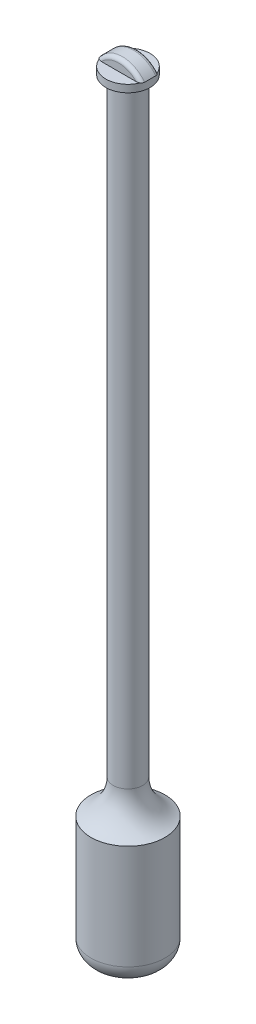
ISO-10303-21;
HEADER;
FILE_DESCRIPTION(('STEP AP214'),'2;1');
FILE_NAME('part.step','',(''),(''),'','','');
FILE_SCHEMA(('AUTOMOTIVE_DESIGN { 1 0 10303 214 1 1 1 1 }'));
ENDSEC;
DATA;
#1=APPLICATION_CONTEXT('core data for automotive mechanical design processes');
#2=APPLICATION_PROTOCOL_DEFINITION('international standard','automotive_design',2000,#1);
#3=PRODUCT_CONTEXT('',#1,'mechanical');
#4=PRODUCT('Part','Part','',(#3));
#5=PRODUCT_RELATED_PRODUCT_CATEGORY('part','',(#4));
#6=PRODUCT_DEFINITION_FORMATION('','',#4);
#7=PRODUCT_DEFINITION_CONTEXT('part definition',#1,'design');
#8=PRODUCT_DEFINITION('design','',#6,#7);
#9=PRODUCT_DEFINITION_SHAPE('','',#8);
#10=(LENGTH_UNIT() NAMED_UNIT(*) SI_UNIT(.MILLI.,.METRE.));
#11=(NAMED_UNIT(*) PLANE_ANGLE_UNIT() SI_UNIT($,.RADIAN.));
#12=(NAMED_UNIT(*) SI_UNIT($,.STERADIAN.) SOLID_ANGLE_UNIT());
#13=UNCERTAINTY_MEASURE_WITH_UNIT(LENGTH_MEASURE(1.E-05),#10,'distance_accuracy_value','');
#14=(GEOMETRIC_REPRESENTATION_CONTEXT(3) GLOBAL_UNCERTAINTY_ASSIGNED_CONTEXT((#13)) GLOBAL_UNIT_ASSIGNED_CONTEXT((#10,
#11,#12)) REPRESENTATION_CONTEXT('',''));
#15=CARTESIAN_POINT('',(0.,0.,0.));
#16=DIRECTION('',(0.,0.,1.));
#17=DIRECTION('',(1.,0.,0.));
#18=AXIS2_PLACEMENT_3D('',#15,#16,#17);
#19=CARTESIAN_POINT('',(6.,209.,0.));
#20=DIRECTION('',(0.,-1.,0.));
#21=DIRECTION('',(0.,0.,-1.));
#22=AXIS2_PLACEMENT_3D('',#19,#20,#21);
#23=PLANE('',#22);
#24=DIRECTION('',(1.,0.,0.));
#25=VECTOR('',#24,1.);
#26=CARTESIAN_POINT('',(-6.,209.,2.5));
#27=LINE('',#26,#25);
#28=CARTESIAN_POINT('',(-4.69041575982343,209.,2.5));
#29=VERTEX_POINT('',#28);
#30=CARTESIAN_POINT('',(4.69041575982343,209.,2.5));
#31=VERTEX_POINT('',#30);
#32=EDGE_CURVE('E144',#29,#31,#27,.T.);
#33=ORIENTED_EDGE('',*,*,#32,.F.);
#34=CARTESIAN_POINT('',(-4.69041575982343,209.,2.5));
#35=CARTESIAN_POINT('',(-4.77574325814398,209.,2.49997391904809));
#36=CARTESIAN_POINT('',(-4.86130209307591,209.,2.49430200358767));
#37=CARTESIAN_POINT('',(-5.02865223131832,209.,2.47079207200527));
#38=CARTESIAN_POINT('',(-5.11048485294655,209.,2.45324149410005));
#39=CARTESIAN_POINT('',(-5.25485146725927,209.,2.40985447802828));
#40=CARTESIAN_POINT('',(-5.31805131520623,209.,2.38628387835557));
#41=CARTESIAN_POINT('',(-5.44149509589768,209.,2.32965856214063));
#42=CARTESIAN_POINT('',(-5.50165862849681,209.,2.29642988457705));
#43=CARTESIAN_POINT('',(-5.55879503975131,209.,2.25827316904671));
#44=B_SPLINE_CURVE_WITH_KNOTS('',3,(#34,#35,#36,#37,#38,#39,#40,#41,#42,#43),.UNSPECIFIED.,.F.,
.F.,(4,2,2,2,4),(0.,0.256155563674324,0.506324386732511,0.707996127014092,0.913553014759009),.UNSPECIFIED.);
#45=CARTESIAN_POINT('',(-5.55879503975131,209.,2.25827316904671));
#46=VERTEX_POINT('',#45);
#47=EDGE_CURVE('E232',#29,#46,#44,.T.);
#48=ORIENTED_EDGE('',*,*,#47,.T.);
#49=CARTESIAN_POINT('',(0.,209.,0.));
#50=DIRECTION('',(0.,1.,0.));
#51=DIRECTION('',(0.,0.,1.));
#52=AXIS2_PLACEMENT_3D('',#49,#50,#51);
#53=CIRCLE('',#52,6.);
#54=CARTESIAN_POINT('',(5.55879503975147,209.,2.2582731690463));
#55=VERTEX_POINT('',#54);
#56=EDGE_CURVE('E69',#46,#55,#53,.T.);
#57=ORIENTED_EDGE('',*,*,#56,.T.);
#58=CARTESIAN_POINT('',(5.55879503975147,209.,2.2582731690463));
#59=CARTESIAN_POINT('',(5.48678233533908,209.,2.30632455032236));
#60=CARTESIAN_POINT('',(5.41009743104737,209.,2.34654228222005));
#61=CARTESIAN_POINT('',(5.25247745184863,209.,2.41172382246987));
#62=CARTESIAN_POINT('',(5.17167924843986,209.,2.4370146931475));
#63=CARTESIAN_POINT('',(5.02472243432388,209.,2.47083664106106));
#64=CARTESIAN_POINT('',(4.95908178771194,209.,2.48178108232802));
#65=CARTESIAN_POINT('',(4.82576399561053,209.,2.49642054674034));
#66=CARTESIAN_POINT('',(4.75807158470045,209.,2.49997882393611));
#67=CARTESIAN_POINT('',(4.69041575982343,209.,2.5));
#68=B_SPLINE_CURVE_WITH_KNOTS('',3,(#58,#59,#60,#61,#62,#63,#64,#65,#66,#67),.UNSPECIFIED.,.F.,
.F.,(4,2,2,2,4),(0.,0.258597069952045,0.511294664713215,0.710547332312705,0.913457168868223),.UNSPECIFIED.);
#69=EDGE_CURVE('E240',#55,#31,#68,.T.);
#70=ORIENTED_EDGE('',*,*,#69,.T.);
#71=EDGE_LOOP('',(#33,#48,#57,#70));
#72=FACE_BOUND('',#71,.T.);
#73=ADVANCED_FACE('F39',(#72),#23,.F.);
#74=CARTESIAN_POINT('',(5.55879503975131,209.,-2.25827316904671));
#75=VERTEX_POINT('',#74);
#76=CARTESIAN_POINT('',(-5.55879503975147,209.,-2.2582731690463));
#77=VERTEX_POINT('',#76);
#78=EDGE_CURVE('E61',#75,#77,#53,.T.);
#79=ORIENTED_EDGE('',*,*,#78,.T.);
#80=CARTESIAN_POINT('',(-5.55879503975147,209.,-2.2582731690463));
#81=CARTESIAN_POINT('',(-5.48678233533908,209.,-2.30632455032236));
#82=CARTESIAN_POINT('',(-5.41009743104736,209.,-2.34654228222005));
#83=CARTESIAN_POINT('',(-5.25247745184863,209.,-2.41172382246987));
#84=CARTESIAN_POINT('',(-5.17167924843985,209.,-2.4370146931475));
#85=CARTESIAN_POINT('',(-5.02472243432388,209.,-2.47083664106106));
#86=CARTESIAN_POINT('',(-4.95908178771194,209.,-2.48178108232802));
#87=CARTESIAN_POINT('',(-4.82576399561053,209.,-2.49642054674034));
#88=CARTESIAN_POINT('',(-4.75807158470045,209.,-2.49997882393611));
#89=CARTESIAN_POINT('',(-4.69041575982343,209.,-2.5));
#90=B_SPLINE_CURVE_WITH_KNOTS('',3,(#80,#81,#82,#83,#84,#85,#86,#87,#88,#89),.UNSPECIFIED.,.F.,
.F.,(4,2,2,2,4),(0.,0.258597069952045,0.511294664713215,0.710547332312702,0.91345716886822),.UNSPECIFIED.);
#91=CARTESIAN_POINT('',(-4.69041575982343,209.,-2.5));
#92=VERTEX_POINT('',#91);
#93=EDGE_CURVE('E54',#77,#92,#90,.T.);
#94=ORIENTED_EDGE('',*,*,#93,.T.);
#95=DIRECTION('',(1.,0.,0.));
#96=VECTOR('',#95,1.);
#97=CARTESIAN_POINT('',(-6.,209.,-2.5));
#98=LINE('',#97,#96);
#99=CARTESIAN_POINT('',(4.69041575982343,209.,-2.5));
#100=VERTEX_POINT('',#99);
#101=EDGE_CURVE('E147',#92,#100,#98,.T.);
#102=ORIENTED_EDGE('',*,*,#101,.T.);
#103=CARTESIAN_POINT('',(4.69041575982343,209.,-2.5));
#104=CARTESIAN_POINT('',(4.77574325814398,209.,-2.49997391904809));
#105=CARTESIAN_POINT('',(4.86130209307591,209.,-2.49430200358767));
#106=CARTESIAN_POINT('',(5.02865223131832,209.,-2.47079207200527));
#107=CARTESIAN_POINT('',(5.11048485294655,209.,-2.45324149410005));
#108=CARTESIAN_POINT('',(5.25485146725927,209.,-2.40985447802828));
#109=CARTESIAN_POINT('',(5.31805131520623,209.,-2.38628387835557));
#110=CARTESIAN_POINT('',(5.44149509589768,209.,-2.32965856214063));
#111=CARTESIAN_POINT('',(5.50165862849681,209.,-2.29642988457705));
#112=CARTESIAN_POINT('',(5.55879503975131,209.,-2.25827316904671));
#113=B_SPLINE_CURVE_WITH_KNOTS('',3,(#103,#104,#105,#106,#107,#108,#109,#110,#111,#112),
.UNSPECIFIED.,.F.,.F.,(4,2,2,2,4),(0.,0.256155563674324,0.506324386732511,0.707996127014092,
0.913553014759008),.UNSPECIFIED.);
#114=EDGE_CURVE('E11',#100,#75,#113,.T.);
#115=ORIENTED_EDGE('',*,*,#114,.T.);
#116=EDGE_LOOP('',(#79,#94,#102,#115));
#117=FACE_BOUND('',#116,.T.);
#118=ADVANCED_FACE('F245',(#117),#23,.F.);
#119=CARTESIAN_POINT('',(0.,0.,0.));
#120=DIRECTION('',(0.,1.,0.));
#121=DIRECTION('',(0.,0.,1.));
#122=AXIS2_PLACEMENT_3D('',#119,#120,#121);
#123=CYLINDRICAL_SURFACE('',#122,6.);
#124=CARTESIAN_POINT('',(6.,209.,0.));
#125=VERTEX_POINT('',#124);
#126=EDGE_CURVE('E111',#55,#125,#53,.T.);
#127=ORIENTED_EDGE('',*,*,#126,.F.);
#128=ORIENTED_EDGE('',*,*,#56,.F.);
#129=CARTESIAN_POINT('',(-6.,209.,0.));
#130=VERTEX_POINT('',#129);
#131=EDGE_CURVE('E180',#130,#46,#53,.T.);
#132=ORIENTED_EDGE('',*,*,#131,.F.);
#133=EDGE_CURVE('E122',#77,#130,#53,.T.);
#134=ORIENTED_EDGE('',*,*,#133,.F.);
#135=ORIENTED_EDGE('',*,*,#78,.F.);
#136=EDGE_CURVE('E120',#125,#75,#53,.T.);
#137=ORIENTED_EDGE('',*,*,#136,.F.);
#138=EDGE_LOOP('',(#127,#128,#132,#134,#135,#137));
#139=FACE_BOUND('',#138,.T.);
#140=CARTESIAN_POINT('',(0.,207.,0.));
#141=DIRECTION('',(0.,1.,0.));
#142=DIRECTION('',(0.,0.,1.));
#143=AXIS2_PLACEMENT_3D('',#140,#141,#142);
#144=CIRCLE('',#143,6.);
#145=CARTESIAN_POINT('',(0.,207.,6.));
#146=VERTEX_POINT('',#145);
#147=EDGE_CURVE('E175',#146,#146,#144,.T.);
#148=ORIENTED_EDGE('',*,*,#147,.T.);
#149=EDGE_LOOP('',(#148));
#150=FACE_BOUND('',#149,.T.);
#151=ADVANCED_FACE('F136',(#139,#150),#123,.T.);
#152=CARTESIAN_POINT('',(3.98903104709802,207.,0.));
#153=DIRECTION('',(0.,1.,0.));
#154=DIRECTION('',(0.,0.,1.));
#155=AXIS2_PLACEMENT_3D('',#152,#153,#154);
#156=PLANE('',#155);
#157=ORIENTED_EDGE('',*,*,#147,.F.);
#158=EDGE_LOOP('',(#157));
#159=FACE_BOUND('',#158,.T.);
#160=CARTESIAN_POINT('',(0.,207.,0.));
#161=DIRECTION('',(0.,1.,0.));
#162=DIRECTION('',(0.,0.,1.));
#163=AXIS2_PLACEMENT_3D('',#160,#161,#162);
#164=CIRCLE('',#163,3.98903104709802);
#165=CARTESIAN_POINT('',(0.,207.,3.98903104709802));
#166=VERTEX_POINT('',#165);
#167=EDGE_CURVE('E171',#166,#166,#164,.T.);
#168=ORIENTED_EDGE('',*,*,#167,.T.);
#169=EDGE_LOOP('',(#168));
#170=FACE_BOUND('',#169,.T.);
#171=ADVANCED_FACE('F299',(#159,#170),#156,.F.);
#172=CARTESIAN_POINT('',(0.,0.,0.));
#173=DIRECTION('',(0.,1.,0.));
#174=DIRECTION('',(0.,0.,1.));
#175=AXIS2_PLACEMENT_3D('',#172,#173,#174);
#176=CYLINDRICAL_SURFACE('',#175,3.98903104709802);
#177=ORIENTED_EDGE('',*,*,#167,.F.);
#178=EDGE_LOOP('',(#177));
#179=FACE_BOUND('',#178,.T.);
#180=CARTESIAN_POINT('',(0.,42.4556311256197,0.));
#181=DIRECTION('',(0.,1.,0.));
#182=DIRECTION('',(0.,0.,1.));
#183=AXIS2_PLACEMENT_3D('',#180,#181,#182);
#184=CIRCLE('',#183,3.98903104709802);
#185=CARTESIAN_POINT('',(0.,42.4556311256197,3.98903104709802));
#186=VERTEX_POINT('',#185);
#187=EDGE_CURVE('E167',#186,#186,#184,.T.);
#188=ORIENTED_EDGE('',*,*,#187,.T.);
#189=EDGE_LOOP('',(#188));
#190=FACE_BOUND('',#189,.T.);
#191=ADVANCED_FACE('F306',(#179,#190),#176,.T.);
#192=CARTESIAN_POINT('',(0.,42.4556311256197,0.));
#193=DIRECTION('',(0.,1.,0.));
#194=DIRECTION('',(0.,0.,1.));
#195=AXIS2_PLACEMENT_3D('',#192,#193,#194);
#196=TOROIDAL_SURFACE('',#195,13.989031047098,10.);
#197=ORIENTED_EDGE('',*,*,#187,.F.);
#198=EDGE_LOOP('',(#197));
#199=FACE_BOUND('',#198,.T.);
#200=CARTESIAN_POINT('',(0.,33.2857003022553,0.));
#201=DIRECTION('',(0.,1.,0.));
#202=DIRECTION('',(0.,0.,1.));
#203=AXIS2_PLACEMENT_3D('',#200,#201,#202);
#204=CIRCLE('',#203,10.);
#205=CARTESIAN_POINT('',(0.,33.2857003022553,10.));
#206=VERTEX_POINT('',#205);
#207=EDGE_CURVE('E163',#206,#206,#204,.T.);
#208=ORIENTED_EDGE('',*,*,#207,.T.);
#209=EDGE_LOOP('',(#208));
#210=FACE_BOUND('',#209,.T.);
#211=ADVANCED_FACE('F313',(#199,#210),#196,.F.);
#212=CARTESIAN_POINT('',(0.,0.,0.));
#213=DIRECTION('',(0.,1.,0.));
#214=DIRECTION('',(0.,0.,1.));
#215=AXIS2_PLACEMENT_3D('',#212,#213,#214);
#216=CYLINDRICAL_SURFACE('',#215,10.);
#217=ORIENTED_EDGE('',*,*,#207,.F.);
#218=EDGE_LOOP('',(#217));
#219=FACE_BOUND('',#218,.T.);
#220=CARTESIAN_POINT('',(0.,5.,0.));
#221=DIRECTION('',(0.,1.,0.));
#222=DIRECTION('',(0.,0.,1.));
#223=AXIS2_PLACEMENT_3D('',#220,#221,#222);
#224=CIRCLE('',#223,10.);
#225=CARTESIAN_POINT('',(0.,5.,10.));
#226=VERTEX_POINT('',#225);
#227=EDGE_CURVE('E159',#226,#226,#224,.T.);
#228=ORIENTED_EDGE('',*,*,#227,.T.);
#229=EDGE_LOOP('',(#228));
#230=FACE_BOUND('',#229,.T.);
#231=ADVANCED_FACE('F321',(#219,#230),#216,.T.);
#232=CARTESIAN_POINT('',(0.,5.,0.));
#233=DIRECTION('',(0.,1.,0.));
#234=DIRECTION('',(0.,0.,1.));
#235=AXIS2_PLACEMENT_3D('',#232,#233,#234);
#236=TOROIDAL_SURFACE('',#235,5.,5.);
#237=ORIENTED_EDGE('',*,*,#227,.F.);
#238=EDGE_LOOP('',(#237));
#239=FACE_BOUND('',#238,.T.);
#240=CARTESIAN_POINT('',(0.,0.,0.));
#241=DIRECTION('',(0.,1.,0.));
#242=DIRECTION('',(0.,0.,1.));
#243=AXIS2_PLACEMENT_3D('',#240,#241,#242);
#244=CIRCLE('',#243,4.99999999999997);
#245=CARTESIAN_POINT('',(0.,0.,4.99999999999997));
#246=VERTEX_POINT('',#245);
#247=EDGE_CURVE('E155',#246,#246,#244,.T.);
#248=ORIENTED_EDGE('',*,*,#247,.T.);
#249=EDGE_LOOP('',(#248));
#250=FACE_BOUND('',#249,.T.);
#251=ADVANCED_FACE('F329',(#239,#250),#236,.T.);
#252=CARTESIAN_POINT('',(0.,0.,0.));
#253=DIRECTION('',(0.,1.,0.));
#254=DIRECTION('',(0.,0.,1.));
#255=AXIS2_PLACEMENT_3D('',#252,#253,#254);
#256=PLANE('',#255);
#257=ORIENTED_EDGE('',*,*,#247,.F.);
#258=EDGE_LOOP('',(#257));
#259=FACE_BOUND('',#258,.T.);
#260=ADVANCED_FACE('F337',(#259),#256,.F.);
#261=CARTESIAN_POINT('',(-6.,209.,2.5));
#262=DIRECTION('',(0.,1.,0.));
#263=DIRECTION('',(0.,0.,1.));
#264=AXIS2_PLACEMENT_3D('',#261,#262,#263);
#265=PLANE('',#264);
#266=DIRECTION('',(0.,0.,-1.));
#267=VECTOR('',#266,1.);
#268=CARTESIAN_POINT('',(6.,209.,2.5));
#269=LINE('',#268,#267);
#270=CARTESIAN_POINT('',(6.,209.,1.5));
#271=VERTEX_POINT('',#270);
#272=EDGE_CURVE('E114',#271,#125,#269,.T.);
#273=ORIENTED_EDGE('',*,*,#272,.F.);
#274=CARTESIAN_POINT('',(6.,209.,1.5));
#275=CARTESIAN_POINT('',(6.00000226156927,209.,1.52398862614259));
#276=CARTESIAN_POINT('',(5.99892014774043,209.,1.54796415057114));
#277=CARTESIAN_POINT('',(5.99461993012782,209.,1.59571272715028));
#278=CARTESIAN_POINT('',(5.99140274528821,209.,1.6194858619537));
#279=CARTESIAN_POINT('',(5.97865241811576,209.,1.68995818605909));
#280=CARTESIAN_POINT('',(5.96601950220793,209.,1.73613002858179));
#281=CARTESIAN_POINT('',(5.93320270634223,209.,1.82558038761212));
#282=CARTESIAN_POINT('',(5.91302887748532,209.,1.86886266544578));
#283=CARTESIAN_POINT('',(5.86609701763331,209.,1.95175536081873));
#284=CARTESIAN_POINT('',(5.83932904945162,209.,1.99136011123585));
#285=CARTESIAN_POINT('',(5.77848573217381,209.,2.06857055010918));
#286=CARTESIAN_POINT('',(5.74405809525524,209.,2.10589634736661));
#287=CARTESIAN_POINT('',(5.67034450640265,209.,2.17528003092579));
#288=CARTESIAN_POINT('',(5.6310638212038,209.,2.2073435415788));
#289=CARTESIAN_POINT('',(5.57966853721921,209.,2.24408830608789));
#290=CARTESIAN_POINT('',(5.56928467234095,209.,2.25126406096179));
#291=CARTESIAN_POINT('',(5.55879503975162,209.,2.2582731690465));
#292=B_SPLINE_CURVE_WITH_KNOTS('',3,(#274,#275,#276,#277,#278,#279,#280,#281,#282,#283,#284,
#285,#286,#287,#288,#289,#290,#291),.UNSPECIFIED.,.F.,.F.,(4,2,2,2,2,2,2,2,4),(0.,
0.07191616525006,0.143801397516404,0.28662630579157,0.429261521092956,0.572113012943839,
0.723897732770571,0.875519152896151,0.913377192848262),.UNSPECIFIED.);
#293=EDGE_CURVE('E116',#271,#55,#292,.T.);
#294=ORIENTED_EDGE('',*,*,#293,.T.);
#295=ORIENTED_EDGE('',*,*,#126,.T.);
#296=EDGE_LOOP('',(#273,#294,#295));
#297=FACE_BOUND('',#296,.T.);
#298=ADVANCED_FACE('F113',(#297),#265,.F.);
#299=ORIENTED_EDGE('',*,*,#136,.T.);
#300=CARTESIAN_POINT('',(5.55879503975131,209.,-2.25827316904671));
#301=CARTESIAN_POINT('',(5.60656649889565,209.,-2.22639881294729));
#302=CARTESIAN_POINT('',(5.6521657772112,209.,-2.19097335715717));
#303=CARTESIAN_POINT('',(5.73758822920924,209.,-2.1130455958688));
#304=CARTESIAN_POINT('',(5.77735479665386,209.,-2.07048156418655));
#305=CARTESIAN_POINT('',(5.848974579138,209.,-1.97859619431774));
#306=CARTESIAN_POINT('',(5.88077388926566,209.,-1.92923215270933));
#307=CARTESIAN_POINT('',(5.93390190872599,209.,-1.82543009006503));
#308=CARTESIAN_POINT('',(5.95529180799997,209.,-1.77102401559188));
#309=CARTESIAN_POINT('',(5.98035948682722,209.,-1.6801248158731));
#310=CARTESIAN_POINT('',(5.98767423618845,209.,-1.64460574932503));
#311=CARTESIAN_POINT('',(5.99751657615567,209.,-1.5727388395459));
#312=CARTESIAN_POINT('',(6.00002099314964,209.,-1.53638783386403));
#313=CARTESIAN_POINT('',(6.,209.,-1.5));
#314=B_SPLINE_CURVE_WITH_KNOTS('',3,(#300,#301,#302,#303,#304,#305,#306,#307,#308,#309,#310,
#311,#312,#313),.UNSPECIFIED.,.F.,.F.,(4,2,2,2,2,2,4),(0.,0.172394268430383,0.346364306442056,
0.52148140355742,0.695556282533502,0.804045935788402,0.913056936124751),.UNSPECIFIED.);
#315=CARTESIAN_POINT('',(6.,209.,-1.5));
#316=VERTEX_POINT('',#315);
#317=EDGE_CURVE('E142',#75,#316,#314,.T.);
#318=ORIENTED_EDGE('',*,*,#317,.T.);
#319=EDGE_CURVE('E129',#125,#316,#269,.T.);
#320=ORIENTED_EDGE('',*,*,#319,.F.);
#321=EDGE_LOOP('',(#299,#318,#320));
#322=FACE_BOUND('',#321,.T.);
#323=ADVANCED_FACE('F140',(#322),#265,.F.);
#324=DIRECTION('',(0.,0.,-1.));
#325=VECTOR('',#324,1.);
#326=CARTESIAN_POINT('',(-6.,209.,2.5));
#327=LINE('',#326,#325);
#328=CARTESIAN_POINT('',(-6.,209.,-1.5));
#329=VERTEX_POINT('',#328);
#330=EDGE_CURVE('E134',#130,#329,#327,.T.);
#331=ORIENTED_EDGE('',*,*,#330,.T.);
#332=CARTESIAN_POINT('',(-6.,209.,-1.5));
#333=CARTESIAN_POINT('',(-6.00000226156927,209.,-1.52398862614259));
#334=CARTESIAN_POINT('',(-5.99892014774043,209.,-1.54796415057114));
#335=CARTESIAN_POINT('',(-5.99461993012782,209.,-1.59571272715028));
#336=CARTESIAN_POINT('',(-5.99140274528821,209.,-1.6194858619537));
#337=CARTESIAN_POINT('',(-5.97865241811576,209.,-1.68995818605909));
#338=CARTESIAN_POINT('',(-5.96601950220793,209.,-1.73613002858179));
#339=CARTESIAN_POINT('',(-5.93320270634223,209.,-1.82558038761212));
#340=CARTESIAN_POINT('',(-5.91302887748532,209.,-1.86886266544578));
#341=CARTESIAN_POINT('',(-5.86609701763331,209.,-1.95175536081873));
#342=CARTESIAN_POINT('',(-5.83932904945162,209.,-1.99136011123585));
#343=CARTESIAN_POINT('',(-5.77848573217381,209.,-2.06857055010918));
#344=CARTESIAN_POINT('',(-5.74405809525524,209.,-2.10589634736661));
#345=CARTESIAN_POINT('',(-5.67034450640265,209.,-2.17528003092579));
#346=CARTESIAN_POINT('',(-5.6310638212038,209.,-2.2073435415788));
#347=CARTESIAN_POINT('',(-5.57966853721921,209.,-2.24408830608789));
#348=CARTESIAN_POINT('',(-5.56928467234094,209.,-2.25126406096179));
#349=CARTESIAN_POINT('',(-5.55879503975162,209.,-2.2582731690465));
#350=B_SPLINE_CURVE_WITH_KNOTS('',3,(#332,#333,#334,#335,#336,#337,#338,#339,#340,#341,#342,
#343,#344,#345,#346,#347,#348,#349),.UNSPECIFIED.,.F.,.F.,(4,2,2,2,2,2,2,2,4),(0.,
0.0719161652500604,0.143801397516404,0.28662630579157,0.429261521092956,0.572113012943839,
0.72389773277057,0.875519152896151,0.913377192848265),.UNSPECIFIED.);
#351=EDGE_CURVE('E217',#329,#77,#350,.T.);
#352=ORIENTED_EDGE('',*,*,#351,.T.);
#353=ORIENTED_EDGE('',*,*,#133,.T.);
#354=EDGE_LOOP('',(#331,#352,#353));
#355=FACE_BOUND('',#354,.T.);
#356=ADVANCED_FACE('F203',(#355),#265,.F.);
#357=CARTESIAN_POINT('',(0.,204.5,2.5));
#358=DIRECTION('',(0.,0.,-1.));
#359=DIRECTION('',(-1.,0.,0.));
#360=AXIS2_PLACEMENT_3D('',#357,#358,#359);
#361=CYLINDRICAL_SURFACE('',#360,7.5);
#362=CARTESIAN_POINT('',(-6.,209.,1.5));
#363=VERTEX_POINT('',#362);
#364=EDGE_CURVE('E151',#363,#130,#327,.T.);
#365=ORIENTED_EDGE('',*,*,#364,.F.);
#366=CARTESIAN_POINT('',(0.,204.5,1.5));
#367=DIRECTION('',(0.,0.,-1.));
#368=DIRECTION('',(-1.,0.,0.));
#369=AXIS2_PLACEMENT_3D('',#366,#367,#368);
#370=CIRCLE('',#369,7.5);
#371=EDGE_CURVE('E132',#363,#271,#370,.T.);
#372=ORIENTED_EDGE('',*,*,#371,.T.);
#373=ORIENTED_EDGE('',*,*,#272,.T.);
#374=ORIENTED_EDGE('',*,*,#319,.T.);
#375=CARTESIAN_POINT('',(0.,204.5,-1.5));
#376=DIRECTION('',(0.,0.,-1.));
#377=DIRECTION('',(-1.,0.,0.));
#378=AXIS2_PLACEMENT_3D('',#375,#376,#377);
#379=CIRCLE('',#378,7.5);
#380=EDGE_CURVE('E192',#316,#329,#379,.F.);
#381=ORIENTED_EDGE('',*,*,#380,.T.);
#382=ORIENTED_EDGE('',*,*,#330,.F.);
#383=EDGE_LOOP('',(#365,#372,#373,#374,#381,#382));
#384=FACE_BOUND('',#383,.T.);
#385=ADVANCED_FACE('F126',(#384),#361,.T.);
#386=ORIENTED_EDGE('',*,*,#131,.T.);
#387=CARTESIAN_POINT('',(-5.55879503975131,209.,2.25827316904671));
#388=CARTESIAN_POINT('',(-5.60656649889565,209.,2.22639881294729));
#389=CARTESIAN_POINT('',(-5.6521657772112,209.,2.19097335715717));
#390=CARTESIAN_POINT('',(-5.73758822920924,209.,2.1130455958688));
#391=CARTESIAN_POINT('',(-5.77735479665386,209.,2.07048156418655));
#392=CARTESIAN_POINT('',(-5.848974579138,209.,1.97859619431774));
#393=CARTESIAN_POINT('',(-5.88077388926566,209.,1.92923215270933));
#394=CARTESIAN_POINT('',(-5.93390190872599,209.,1.82543009006504));
#395=CARTESIAN_POINT('',(-5.95529180799997,209.,1.77102401559188));
#396=CARTESIAN_POINT('',(-5.98035948682722,209.,1.6801248158731));
#397=CARTESIAN_POINT('',(-5.98767423618845,209.,1.64460574932503));
#398=CARTESIAN_POINT('',(-5.99751657615567,209.,1.5727388395459));
#399=CARTESIAN_POINT('',(-6.00002099314964,209.,1.53638783386403));
#400=CARTESIAN_POINT('',(-6.,209.,1.5));
#401=B_SPLINE_CURVE_WITH_KNOTS('',3,(#387,#388,#389,#390,#391,#392,#393,#394,#395,#396,#397,
#398,#399,#400),.UNSPECIFIED.,.F.,.F.,(4,2,2,2,2,2,4),(0.,0.172394268430383,0.346364306442056,
0.52148140355742,0.695556282533502,0.804045935788401,0.913056936124751),.UNSPECIFIED.);
#402=EDGE_CURVE('E184',#46,#363,#401,.T.);
#403=ORIENTED_EDGE('',*,*,#402,.T.);
#404=ORIENTED_EDGE('',*,*,#364,.T.);
#405=EDGE_LOOP('',(#386,#403,#404));
#406=FACE_BOUND('',#405,.T.);
#407=ADVANCED_FACE('F196',(#406),#265,.F.);
#408=CARTESIAN_POINT('',(0.,204.5,2.5));
#409=DIRECTION('',(0.,0.,-1.));
#410=DIRECTION('',(-1.,0.,0.));
#411=AXIS2_PLACEMENT_3D('',#408,#409,#410);
#412=PLANE('',#411);
#413=ORIENTED_EDGE('',*,*,#32,.T.);
#414=CARTESIAN_POINT('',(0.,204.5,2.5));
#415=DIRECTION('',(0.,0.,-1.));
#416=DIRECTION('',(-1.,0.,0.));
#417=AXIS2_PLACEMENT_3D('',#414,#415,#416);
#418=CIRCLE('',#417,6.5);
#419=EDGE_CURVE('E119',#31,#29,#418,.F.);
#420=ORIENTED_EDGE('',*,*,#419,.T.);
#421=EDGE_LOOP('',(#413,#420));
#422=FACE_BOUND('',#421,.T.);
#423=ADVANCED_FACE('F201',(#422),#412,.F.);
#424=CARTESIAN_POINT('',(0.,204.5,-2.5));
#425=DIRECTION('',(0.,0.,-1.));
#426=DIRECTION('',(-1.,0.,0.));
#427=AXIS2_PLACEMENT_3D('',#424,#425,#426);
#428=PLANE('',#427);
#429=ORIENTED_EDGE('',*,*,#101,.F.);
#430=CARTESIAN_POINT('',(0.,204.5,-2.5));
#431=DIRECTION('',(0.,0.,-1.));
#432=DIRECTION('',(-1.,0.,0.));
#433=AXIS2_PLACEMENT_3D('',#430,#431,#432);
#434=CIRCLE('',#433,6.5);
#435=EDGE_CURVE('E224',#92,#100,#434,.T.);
#436=ORIENTED_EDGE('',*,*,#435,.T.);
#437=EDGE_LOOP('',(#429,#436));
#438=FACE_BOUND('',#437,.T.);
#439=ADVANCED_FACE('F204',(#438),#428,.T.);
#440=CARTESIAN_POINT('',(0.,204.5,1.5));
#441=DIRECTION('',(0.,0.,-1.));
#442=DIRECTION('',(-1.,0.,0.));
#443=AXIS2_PLACEMENT_3D('',#440,#441,#442);
#444=TOROIDAL_SURFACE('',#443,6.5,1.);
#445=ORIENTED_EDGE('',*,*,#293,.F.);
#446=ORIENTED_EDGE('',*,*,#371,.F.);
#447=ORIENTED_EDGE('',*,*,#402,.F.);
#448=ORIENTED_EDGE('',*,*,#47,.F.);
#449=ORIENTED_EDGE('',*,*,#419,.F.);
#450=ORIENTED_EDGE('',*,*,#69,.F.);
#451=EDGE_LOOP('',(#445,#446,#447,#448,#449,#450));
#452=FACE_BOUND('',#451,.T.);
#453=ADVANCED_FACE('F194',(#452),#444,.T.);
#454=CARTESIAN_POINT('',(0.,204.5,-1.5));
#455=DIRECTION('',(0.,0.,-1.));
#456=DIRECTION('',(-1.,0.,0.));
#457=AXIS2_PLACEMENT_3D('',#454,#455,#456);
#458=TOROIDAL_SURFACE('',#457,6.5,1.);
#459=ORIENTED_EDGE('',*,*,#114,.F.);
#460=ORIENTED_EDGE('',*,*,#435,.F.);
#461=ORIENTED_EDGE('',*,*,#93,.F.);
#462=ORIENTED_EDGE('',*,*,#351,.F.);
#463=ORIENTED_EDGE('',*,*,#380,.F.);
#464=ORIENTED_EDGE('',*,*,#317,.F.);
#465=EDGE_LOOP('',(#459,#460,#461,#462,#463,#464));
#466=FACE_BOUND('',#465,.T.);
#467=ADVANCED_FACE('F41',(#466),#458,.T.);
#468=CLOSED_SHELL('',(#73,#118,#151,#171,#191,#211,#231,#251,#260,#298,#323,#356,#385,#407,#423,
#439,#453,#467));
#469=MANIFOLD_SOLID_BREP('B2',#468);
#470=ADVANCED_BREP_SHAPE_REPRESENTATION('',(#18,#469),#14);
#471=SHAPE_DEFINITION_REPRESENTATION(#9,#470);
ENDSEC;
END-ISO-10303-21;
